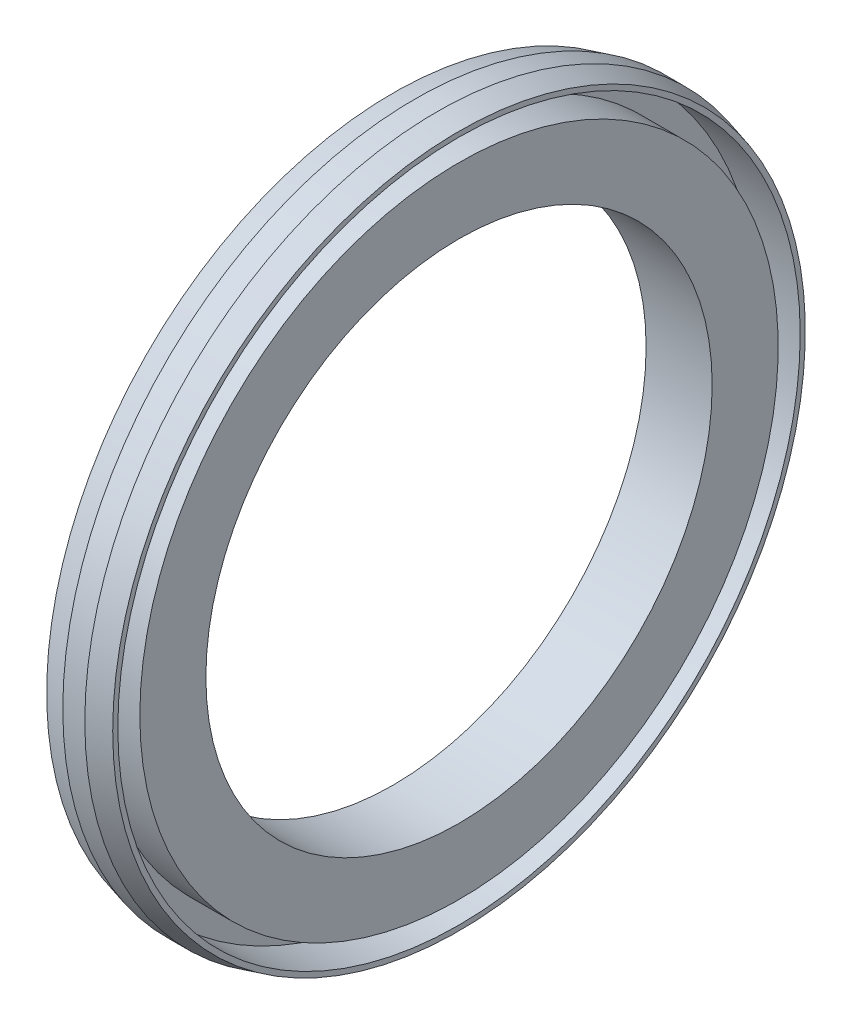
ISO-10303-21;
HEADER;
FILE_DESCRIPTION(('STEP AP214'),'2;1');
FILE_NAME('part.step','',(''),(''),'','','');
FILE_SCHEMA(('AUTOMOTIVE_DESIGN { 1 0 10303 214 1 1 1 1 }'));
ENDSEC;
DATA;
#1=APPLICATION_CONTEXT('core data for automotive mechanical design processes');
#2=APPLICATION_PROTOCOL_DEFINITION('international standard','automotive_design',2000,#1);
#3=PRODUCT_CONTEXT('',#1,'mechanical');
#4=PRODUCT('Part','Part','',(#3));
#5=PRODUCT_RELATED_PRODUCT_CATEGORY('part','',(#4));
#6=PRODUCT_DEFINITION_FORMATION('','',#4);
#7=PRODUCT_DEFINITION_CONTEXT('part definition',#1,'design');
#8=PRODUCT_DEFINITION('design','',#6,#7);
#9=PRODUCT_DEFINITION_SHAPE('','',#8);
#10=(LENGTH_UNIT() NAMED_UNIT(*) SI_UNIT(.MILLI.,.METRE.));
#11=(NAMED_UNIT(*) PLANE_ANGLE_UNIT() SI_UNIT($,.RADIAN.));
#12=(NAMED_UNIT(*) SI_UNIT($,.STERADIAN.) SOLID_ANGLE_UNIT());
#13=UNCERTAINTY_MEASURE_WITH_UNIT(LENGTH_MEASURE(1.E-05),#10,'distance_accuracy_value','');
#14=(GEOMETRIC_REPRESENTATION_CONTEXT(3) GLOBAL_UNCERTAINTY_ASSIGNED_CONTEXT((#13)) GLOBAL_UNIT_ASSIGNED_CONTEXT((#10,
#11,#12)) REPRESENTATION_CONTEXT('',''));
#15=CARTESIAN_POINT('',(0.,0.,0.));
#16=DIRECTION('',(0.,0.,1.));
#17=DIRECTION('',(1.,0.,0.));
#18=AXIS2_PLACEMENT_3D('',#15,#16,#17);
#19=CARTESIAN_POINT('',(3.,11.5,0.));
#20=DIRECTION('',(-1.,0.,0.));
#21=DIRECTION('',(0.,0.,1.));
#22=AXIS2_PLACEMENT_3D('',#19,#20,#21);
#23=PLANE('',#22);
#24=CARTESIAN_POINT('',(3.,0.,0.));
#25=DIRECTION('',(-1.,0.,0.));
#26=DIRECTION('',(0.,0.,1.));
#27=AXIS2_PLACEMENT_3D('',#24,#25,#26);
#28=CIRCLE('',#27,11.5);
#29=CARTESIAN_POINT('',(3.,0.,11.5));
#30=VERTEX_POINT('',#29);
#31=EDGE_CURVE('E17',#30,#30,#28,.F.);
#32=ORIENTED_EDGE('',*,*,#31,.F.);
#33=EDGE_LOOP('',(#32));
#34=FACE_BOUND('',#33,.T.);
#35=CARTESIAN_POINT('',(3.,0.,0.));
#36=DIRECTION('',(-1.,0.,0.));
#37=DIRECTION('',(0.,0.,1.));
#38=AXIS2_PLACEMENT_3D('',#35,#36,#37);
#39=CIRCLE('',#38,14.5);
#40=CARTESIAN_POINT('',(3.,0.,14.5));
#41=VERTEX_POINT('',#40);
#42=EDGE_CURVE('E57',#41,#41,#39,.T.);
#43=ORIENTED_EDGE('',*,*,#42,.F.);
#44=EDGE_LOOP('',(#43));
#45=FACE_BOUND('',#44,.T.);
#46=ADVANCED_FACE('F14',(#34,#45),#23,.F.);
#47=CARTESIAN_POINT('',(3.,0.,0.));
#48=DIRECTION('',(-1.,0.,0.));
#49=DIRECTION('',(0.,0.,1.));
#50=AXIS2_PLACEMENT_3D('',#47,#48,#49);
#51=CYLINDRICAL_SURFACE('',#50,11.5);
#52=CARTESIAN_POINT('',(0.,0.,0.));
#53=DIRECTION('',(-1.,0.,0.));
#54=DIRECTION('',(0.,0.,1.));
#55=AXIS2_PLACEMENT_3D('',#52,#53,#54);
#56=CIRCLE('',#55,11.5);
#57=CARTESIAN_POINT('',(0.,0.,11.5));
#58=VERTEX_POINT('',#57);
#59=EDGE_CURVE('E55',#58,#58,#56,.F.);
#60=ORIENTED_EDGE('',*,*,#59,.F.);
#61=EDGE_LOOP('',(#60));
#62=FACE_BOUND('',#61,.T.);
#63=ORIENTED_EDGE('',*,*,#31,.T.);
#64=EDGE_LOOP('',(#63));
#65=FACE_BOUND('',#64,.T.);
#66=ADVANCED_FACE('F64',(#62,#65),#51,.F.);
#67=CARTESIAN_POINT('',(1.,0.,0.));
#68=DIRECTION('',(-1.,0.,0.));
#69=DIRECTION('',(0.,0.,1.));
#70=AXIS2_PLACEMENT_3D('',#67,#68,#69);
#71=CYLINDRICAL_SURFACE('',#70,14.5);
#72=ORIENTED_EDGE('',*,*,#42,.T.);
#73=EDGE_LOOP('',(#72));
#74=FACE_BOUND('',#73,.T.);
#75=CARTESIAN_POINT('',(1.,0.,0.));
#76=DIRECTION('',(-1.,0.,0.));
#77=DIRECTION('',(0.,0.,1.));
#78=AXIS2_PLACEMENT_3D('',#75,#76,#77);
#79=CIRCLE('',#78,14.5);
#80=CARTESIAN_POINT('',(1.,0.,14.5));
#81=VERTEX_POINT('',#80);
#82=EDGE_CURVE('E52',#81,#81,#79,.T.);
#83=ORIENTED_EDGE('',*,*,#82,.F.);
#84=EDGE_LOOP('',(#83));
#85=FACE_BOUND('',#84,.T.);
#86=ADVANCED_FACE('F72',(#74,#85),#71,.T.);
#87=CARTESIAN_POINT('',(0.,11.5,0.));
#88=DIRECTION('',(1.,0.,0.));
#89=DIRECTION('',(0.,0.,-1.));
#90=AXIS2_PLACEMENT_3D('',#87,#88,#89);
#91=PLANE('',#90);
#92=ORIENTED_EDGE('',*,*,#59,.T.);
#93=EDGE_LOOP('',(#92));
#94=FACE_BOUND('',#93,.T.);
#95=CARTESIAN_POINT('',(0.,0.,0.));
#96=DIRECTION('',(-1.,0.,0.));
#97=DIRECTION('',(0.,0.,1.));
#98=AXIS2_PLACEMENT_3D('',#95,#96,#97);
#99=CIRCLE('',#98,12.5);
#100=CARTESIAN_POINT('',(0.,0.,12.5));
#101=VERTEX_POINT('',#100);
#102=EDGE_CURVE('E49',#101,#101,#99,.F.);
#103=ORIENTED_EDGE('',*,*,#102,.F.);
#104=EDGE_LOOP('',(#103));
#105=FACE_BOUND('',#104,.T.);
#106=ADVANCED_FACE('F116',(#94,#105),#91,.F.);
#107=CARTESIAN_POINT('',(1.,15.5,0.));
#108=DIRECTION('',(-1.,0.,0.));
#109=DIRECTION('',(0.,0.,1.));
#110=AXIS2_PLACEMENT_3D('',#107,#108,#109);
#111=PLANE('',#110);
#112=ORIENTED_EDGE('',*,*,#82,.T.);
#113=EDGE_LOOP('',(#112));
#114=FACE_BOUND('',#113,.T.);
#115=CARTESIAN_POINT('',(1.,0.,0.));
#116=DIRECTION('',(-1.,0.,0.));
#117=DIRECTION('',(0.,0.,1.));
#118=AXIS2_PLACEMENT_3D('',#115,#116,#117);
#119=CIRCLE('',#118,15.5);
#120=CARTESIAN_POINT('',(1.,0.,15.5));
#121=VERTEX_POINT('',#120);
#122=EDGE_CURVE('E46',#121,#121,#119,.T.);
#123=ORIENTED_EDGE('',*,*,#122,.F.);
#124=EDGE_LOOP('',(#123));
#125=FACE_BOUND('',#124,.T.);
#126=ADVANCED_FACE('F112',(#114,#125),#111,.F.);
#127=CARTESIAN_POINT('',(0.,0.,0.));
#128=DIRECTION('',(-1.,0.,0.));
#129=DIRECTION('',(0.,0.,1.));
#130=AXIS2_PLACEMENT_3D('',#127,#128,#129);
#131=CYLINDRICAL_SURFACE('',#130,12.5);
#132=CARTESIAN_POINT('',(2.,0.,0.));
#133=DIRECTION('',(-1.,0.,0.));
#134=DIRECTION('',(0.,0.,1.));
#135=AXIS2_PLACEMENT_3D('',#132,#133,#134);
#136=CIRCLE('',#135,12.5);
#137=CARTESIAN_POINT('',(2.,0.,12.5));
#138=VERTEX_POINT('',#137);
#139=EDGE_CURVE('E43',#138,#138,#136,.F.);
#140=ORIENTED_EDGE('',*,*,#139,.F.);
#141=EDGE_LOOP('',(#140));
#142=FACE_BOUND('',#141,.T.);
#143=ORIENTED_EDGE('',*,*,#102,.T.);
#144=EDGE_LOOP('',(#143));
#145=FACE_BOUND('',#144,.T.);
#146=ADVANCED_FACE('F108',(#142,#145),#131,.T.);
#147=CARTESIAN_POINT('',(3.,0.,0.));
#148=DIRECTION('',(-1.,0.,0.));
#149=DIRECTION('',(0.,0.,1.));
#150=AXIS2_PLACEMENT_3D('',#147,#148,#149);
#151=CYLINDRICAL_SURFACE('',#150,15.5);
#152=ORIENTED_EDGE('',*,*,#122,.T.);
#153=EDGE_LOOP('',(#152));
#154=FACE_BOUND('',#153,.T.);
#155=CARTESIAN_POINT('',(3.,0.,0.));
#156=DIRECTION('',(-1.,0.,0.));
#157=DIRECTION('',(0.,0.,1.));
#158=AXIS2_PLACEMENT_3D('',#155,#156,#157);
#159=CIRCLE('',#158,15.5);
#160=CARTESIAN_POINT('',(3.,0.,15.5));
#161=VERTEX_POINT('',#160);
#162=EDGE_CURVE('E40',#161,#161,#159,.T.);
#163=ORIENTED_EDGE('',*,*,#162,.F.);
#164=EDGE_LOOP('',(#163));
#165=FACE_BOUND('',#164,.T.);
#166=ADVANCED_FACE('F104',(#154,#165),#151,.F.);
#167=CARTESIAN_POINT('',(2.,12.5,0.));
#168=DIRECTION('',(1.,0.,0.));
#169=DIRECTION('',(0.,0.,-1.));
#170=AXIS2_PLACEMENT_3D('',#167,#168,#169);
#171=PLANE('',#170);
#172=ORIENTED_EDGE('',*,*,#139,.T.);
#173=EDGE_LOOP('',(#172));
#174=FACE_BOUND('',#173,.T.);
#175=CARTESIAN_POINT('',(2.,0.,0.));
#176=DIRECTION('',(-1.,0.,0.));
#177=DIRECTION('',(0.,0.,1.));
#178=AXIS2_PLACEMENT_3D('',#175,#176,#177);
#179=CIRCLE('',#178,13.5);
#180=CARTESIAN_POINT('',(2.,0.,13.5));
#181=VERTEX_POINT('',#180);
#182=EDGE_CURVE('E37',#181,#181,#179,.F.);
#183=ORIENTED_EDGE('',*,*,#182,.F.);
#184=EDGE_LOOP('',(#183));
#185=FACE_BOUND('',#184,.T.);
#186=ADVANCED_FACE('F100',(#174,#185),#171,.F.);
#187=CARTESIAN_POINT('',(3.,15.5,0.));
#188=DIRECTION('',(-1.,0.,0.));
#189=DIRECTION('',(0.,0.,1.));
#190=AXIS2_PLACEMENT_3D('',#187,#188,#189);
#191=PLANE('',#190);
#192=ORIENTED_EDGE('',*,*,#162,.T.);
#193=EDGE_LOOP('',(#192));
#194=FACE_BOUND('',#193,.T.);
#195=CARTESIAN_POINT('',(3.,0.,0.));
#196=DIRECTION('',(-1.,0.,0.));
#197=DIRECTION('',(0.,0.,1.));
#198=AXIS2_PLACEMENT_3D('',#195,#196,#197);
#199=CIRCLE('',#198,15.732050808);
#200=CARTESIAN_POINT('',(3.,0.,15.732050808));
#201=VERTEX_POINT('',#200);
#202=EDGE_CURVE('E34',#201,#201,#199,.T.);
#203=ORIENTED_EDGE('',*,*,#202,.F.);
#204=EDGE_LOOP('',(#203));
#205=FACE_BOUND('',#204,.T.);
#206=ADVANCED_FACE('F96',(#194,#205),#191,.F.);
#207=CARTESIAN_POINT('',(2.,0.,0.));
#208=DIRECTION('',(-1.,0.,0.));
#209=DIRECTION('',(0.,0.,1.));
#210=AXIS2_PLACEMENT_3D('',#207,#208,#209);
#211=CYLINDRICAL_SURFACE('',#210,13.5);
#212=CARTESIAN_POINT('',(0.,0.,0.));
#213=DIRECTION('',(-1.,0.,0.));
#214=DIRECTION('',(0.,0.,1.));
#215=AXIS2_PLACEMENT_3D('',#212,#213,#214);
#216=CIRCLE('',#215,13.5);
#217=CARTESIAN_POINT('',(0.,0.,13.5));
#218=VERTEX_POINT('',#217);
#219=EDGE_CURVE('E30',#218,#218,#216,.F.);
#220=ORIENTED_EDGE('',*,*,#219,.F.);
#221=EDGE_LOOP('',(#220));
#222=FACE_BOUND('',#221,.T.);
#223=ORIENTED_EDGE('',*,*,#182,.T.);
#224=EDGE_LOOP('',(#223));
#225=FACE_BOUND('',#224,.T.);
#226=ADVANCED_FACE('F92',(#222,#225),#211,.F.);
#227=CARTESIAN_POINT('',(2.,0.,0.));
#228=DIRECTION('',(-1.,0.,0.));
#229=DIRECTION('',(0.,0.,1.));
#230=AXIS2_PLACEMENT_3D('',#227,#228,#229);
#231=CONICAL_SURFACE('',#230,16.,0.261799387396906);
#232=ORIENTED_EDGE('',*,*,#202,.T.);
#233=EDGE_LOOP('',(#232));
#234=FACE_BOUND('',#233,.T.);
#235=CARTESIAN_POINT('',(2.,0.,0.));
#236=DIRECTION('',(-1.,0.,0.));
#237=DIRECTION('',(0.,0.,1.));
#238=AXIS2_PLACEMENT_3D('',#235,#236,#237);
#239=CIRCLE('',#238,16.);
#240=CARTESIAN_POINT('',(2.,0.,16.));
#241=VERTEX_POINT('',#240);
#242=EDGE_CURVE('E26',#241,#241,#239,.T.);
#243=ORIENTED_EDGE('',*,*,#242,.F.);
#244=EDGE_LOOP('',(#243));
#245=FACE_BOUND('',#244,.T.);
#246=ADVANCED_FACE('F88',(#234,#245),#231,.T.);
#247=CARTESIAN_POINT('',(0.,13.5,0.));
#248=DIRECTION('',(1.,0.,0.));
#249=DIRECTION('',(0.,0.,-1.));
#250=AXIS2_PLACEMENT_3D('',#247,#248,#249);
#251=PLANE('',#250);
#252=ORIENTED_EDGE('',*,*,#219,.T.);
#253=EDGE_LOOP('',(#252));
#254=FACE_BOUND('',#253,.T.);
#255=CARTESIAN_POINT('',(0.,0.,0.));
#256=DIRECTION('',(1.,0.,0.));
#257=DIRECTION('',(0.,0.,-1.));
#258=AXIS2_PLACEMENT_3D('',#255,#256,#257);
#259=CIRCLE('',#258,15.732050808);
#260=CARTESIAN_POINT('',(0.,0.,-15.732050808));
#261=VERTEX_POINT('',#260);
#262=EDGE_CURVE('E21',#261,#261,#259,.T.);
#263=ORIENTED_EDGE('',*,*,#262,.F.);
#264=EDGE_LOOP('',(#263));
#265=FACE_BOUND('',#264,.T.);
#266=ADVANCED_FACE('F82',(#254,#265),#251,.F.);
#267=CARTESIAN_POINT('',(1.,0.,0.));
#268=DIRECTION('',(-1.,0.,0.));
#269=DIRECTION('',(0.,0.,1.));
#270=AXIS2_PLACEMENT_3D('',#267,#268,#269);
#271=CYLINDRICAL_SURFACE('',#270,16.);
#272=ORIENTED_EDGE('',*,*,#242,.T.);
#273=EDGE_LOOP('',(#272));
#274=FACE_BOUND('',#273,.T.);
#275=CARTESIAN_POINT('',(0.99999999999989,0.,0.));
#276=DIRECTION('',(1.,0.,0.));
#277=DIRECTION('',(0.,0.,-1.));
#278=AXIS2_PLACEMENT_3D('',#275,#276,#277);
#279=CIRCLE('',#278,16.);
#280=CARTESIAN_POINT('',(1.,0.,-16.));
#281=VERTEX_POINT('',#280);
#282=EDGE_CURVE('E10',#281,#281,#279,.F.);
#283=ORIENTED_EDGE('',*,*,#282,.F.);
#284=EDGE_LOOP('',(#283));
#285=FACE_BOUND('',#284,.T.);
#286=ADVANCED_FACE('F76',(#274,#285),#271,.T.);
#287=CARTESIAN_POINT('',(1.,0.,0.));
#288=DIRECTION('',(1.,0.,0.));
#289=DIRECTION('',(0.,0.,-1.));
#290=AXIS2_PLACEMENT_3D('',#287,#288,#289);
#291=CONICAL_SURFACE('',#290,16.,0.261799387396906);
#292=ORIENTED_EDGE('',*,*,#262,.T.);
#293=EDGE_LOOP('',(#292));
#294=FACE_BOUND('',#293,.T.);
#295=ORIENTED_EDGE('',*,*,#282,.T.);
#296=EDGE_LOOP('',(#295));
#297=FACE_BOUND('',#296,.T.);
#298=ADVANCED_FACE('F74',(#294,#297),#291,.T.);
#299=CLOSED_SHELL('',(#46,#66,#86,#106,#126,#146,#166,#186,#206,#226,#246,#266,#286,#298));
#300=MANIFOLD_SOLID_BREP('B1',#299);
#301=ADVANCED_BREP_SHAPE_REPRESENTATION('',(#18,#300),#14);
#302=SHAPE_DEFINITION_REPRESENTATION(#9,#301);
ENDSEC;
END-ISO-10303-21;
